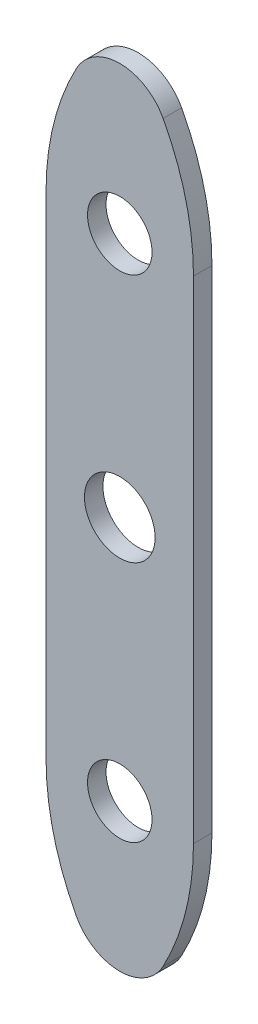
ISO-10303-21;
HEADER;
FILE_DESCRIPTION(('STEP AP214'),'2;1');
FILE_NAME('part.step','',(''),(''),'','','');
FILE_SCHEMA(('AUTOMOTIVE_DESIGN { 1 0 10303 214 1 1 1 1 }'));
ENDSEC;
DATA;
#1=APPLICATION_CONTEXT('core data for automotive mechanical design processes');
#2=APPLICATION_PROTOCOL_DEFINITION('international standard','automotive_design',2000,#1);
#3=PRODUCT_CONTEXT('',#1,'mechanical');
#4=PRODUCT('Part','Part','',(#3));
#5=PRODUCT_RELATED_PRODUCT_CATEGORY('part','',(#4));
#6=PRODUCT_DEFINITION_FORMATION('','',#4);
#7=PRODUCT_DEFINITION_CONTEXT('part definition',#1,'design');
#8=PRODUCT_DEFINITION('design','',#6,#7);
#9=PRODUCT_DEFINITION_SHAPE('','',#8);
#10=(LENGTH_UNIT() NAMED_UNIT(*) SI_UNIT(.MILLI.,.METRE.));
#11=(NAMED_UNIT(*) PLANE_ANGLE_UNIT() SI_UNIT($,.RADIAN.));
#12=(NAMED_UNIT(*) SI_UNIT($,.STERADIAN.) SOLID_ANGLE_UNIT());
#13=UNCERTAINTY_MEASURE_WITH_UNIT(LENGTH_MEASURE(1.E-05),#10,'distance_accuracy_value','');
#14=(GEOMETRIC_REPRESENTATION_CONTEXT(3) GLOBAL_UNCERTAINTY_ASSIGNED_CONTEXT((#13)) GLOBAL_UNIT_ASSIGNED_CONTEXT((#10,
#11,#12)) REPRESENTATION_CONTEXT('',''));
#15=CARTESIAN_POINT('',(0.,0.,0.));
#16=DIRECTION('',(0.,0.,1.));
#17=DIRECTION('',(1.,0.,0.));
#18=AXIS2_PLACEMENT_3D('',#15,#16,#17);
#19=CARTESIAN_POINT('',(-47.625,63.5,4.7752));
#20=DIRECTION('',(0.,0.,1.));
#21=DIRECTION('',(1.,0.,0.));
#22=AXIS2_PLACEMENT_3D('',#19,#20,#21);
#23=PLANE('',#22);
#24=CARTESIAN_POINT('',(0.,-63.5,4.7752));
#25=DIRECTION('',(0.,0.,1.));
#26=DIRECTION('',(1.,0.,0.));
#27=AXIS2_PLACEMENT_3D('',#24,#25,#26);
#28=CIRCLE('',#27,8.334375);
#29=CARTESIAN_POINT('',(8.33437500000002,-63.5,4.7752));
#30=VERTEX_POINT('',#29);
#31=EDGE_CURVE('E231',#30,#30,#28,.T.);
#32=ORIENTED_EDGE('',*,*,#31,.F.);
#33=EDGE_LOOP('',(#32));
#34=FACE_BOUND('',#33,.T.);
#35=CARTESIAN_POINT('',(-47.625,63.5,4.7752));
#36=DIRECTION('',(0.,0.,1.));
#37=DIRECTION('',(1.,0.,0.));
#38=AXIS2_PLACEMENT_3D('',#35,#36,#37);
#39=CIRCLE('',#38,66.675);
#40=CARTESIAN_POINT('',(19.05,63.5,4.7752));
#41=VERTEX_POINT('',#40);
#42=CARTESIAN_POINT('',(11.2058823529412,94.8764705882353,4.7752));
#43=VERTEX_POINT('',#42);
#44=EDGE_CURVE('E136',#41,#43,#39,.T.);
#45=ORIENTED_EDGE('',*,*,#44,.T.);
#46=CARTESIAN_POINT('',(0.,88.9,4.7752));
#47=DIRECTION('',(0.,0.,1.));
#48=DIRECTION('',(1.,0.,0.));
#49=AXIS2_PLACEMENT_3D('',#46,#47,#48);
#50=CIRCLE('',#49,12.7);
#51=CARTESIAN_POINT('',(-11.2058823529412,94.8764705882353,4.7752));
#52=VERTEX_POINT('',#51);
#53=EDGE_CURVE('E113',#43,#52,#50,.T.);
#54=ORIENTED_EDGE('',*,*,#53,.T.);
#55=CARTESIAN_POINT('',(47.625,63.5,4.7752));
#56=DIRECTION('',(0.,0.,1.));
#57=DIRECTION('',(-1.,0.,0.));
#58=AXIS2_PLACEMENT_3D('',#55,#56,#57);
#59=CIRCLE('',#58,66.675);
#60=CARTESIAN_POINT('',(-19.05,63.5,4.7752));
#61=VERTEX_POINT('',#60);
#62=EDGE_CURVE('E139',#52,#61,#59,.T.);
#63=ORIENTED_EDGE('',*,*,#62,.T.);
#64=DIRECTION('',(0.,-1.,0.));
#65=VECTOR('',#64,1.);
#66=CARTESIAN_POINT('',(-19.05,63.5,4.7752));
#67=LINE('',#66,#65);
#68=CARTESIAN_POINT('',(-19.05,-63.5,4.7752));
#69=VERTEX_POINT('',#68);
#70=EDGE_CURVE('E141',#61,#69,#67,.T.);
#71=ORIENTED_EDGE('',*,*,#70,.T.);
#72=CARTESIAN_POINT('',(47.6250000000001,-63.5,4.7752));
#73=DIRECTION('',(0.,0.,1.));
#74=DIRECTION('',(1.,0.,0.));
#75=AXIS2_PLACEMENT_3D('',#72,#73,#74);
#76=CIRCLE('',#75,66.6750000000001);
#77=CARTESIAN_POINT('',(-11.2058823529411,-94.8764705882353,4.7752));
#78=VERTEX_POINT('',#77);
#79=EDGE_CURVE('E143',#69,#78,#76,.T.);
#80=ORIENTED_EDGE('',*,*,#79,.T.);
#81=CARTESIAN_POINT('',(0.,-88.9,4.7752));
#82=DIRECTION('',(0.,0.,1.));
#83=DIRECTION('',(1.,0.,0.));
#84=AXIS2_PLACEMENT_3D('',#81,#82,#83);
#85=CIRCLE('',#84,12.7);
#86=CARTESIAN_POINT('',(11.2058823529412,-94.8764705882353,4.7752));
#87=VERTEX_POINT('',#86);
#88=EDGE_CURVE('E145',#78,#87,#85,.T.);
#89=ORIENTED_EDGE('',*,*,#88,.T.);
#90=CARTESIAN_POINT('',(-47.6250000000001,-63.5,4.7752));
#91=DIRECTION('',(0.,0.,1.));
#92=DIRECTION('',(-1.,0.,0.));
#93=AXIS2_PLACEMENT_3D('',#90,#91,#92);
#94=CIRCLE('',#93,66.6750000000001);
#95=CARTESIAN_POINT('',(19.05,-63.5,4.7752));
#96=VERTEX_POINT('',#95);
#97=EDGE_CURVE('E54',#87,#96,#94,.T.);
#98=ORIENTED_EDGE('',*,*,#97,.T.);
#99=DIRECTION('',(0.,1.,0.));
#100=VECTOR('',#99,1.);
#101=CARTESIAN_POINT('',(19.05,63.5,4.7752));
#102=LINE('',#101,#100);
#103=EDGE_CURVE('E49',#96,#41,#102,.T.);
#104=ORIENTED_EDGE('',*,*,#103,.T.);
#105=EDGE_LOOP('',(#45,#54,#63,#71,#80,#89,#98,#104));
#106=FACE_BOUND('',#105,.T.);
#107=CARTESIAN_POINT('',(0.,0.,4.7752));
#108=DIRECTION('',(0.,0.,1.));
#109=DIRECTION('',(1.,0.,0.));
#110=AXIS2_PLACEMENT_3D('',#107,#108,#109);
#111=CIRCLE('',#110,9.128125);
#112=CARTESIAN_POINT('',(9.128125,0.,4.7752));
#113=VERTEX_POINT('',#112);
#114=EDGE_CURVE('E118',#113,#113,#111,.T.);
#115=ORIENTED_EDGE('',*,*,#114,.F.);
#116=EDGE_LOOP('',(#115));
#117=FACE_BOUND('',#116,.T.);
#118=CARTESIAN_POINT('',(0.,63.5,4.7752));
#119=DIRECTION('',(0.,0.,1.));
#120=DIRECTION('',(1.,0.,0.));
#121=AXIS2_PLACEMENT_3D('',#118,#119,#120);
#122=CIRCLE('',#121,8.334375);
#123=CARTESIAN_POINT('',(8.334375,63.5,4.7752));
#124=VERTEX_POINT('',#123);
#125=EDGE_CURVE('E220',#124,#124,#122,.T.);
#126=ORIENTED_EDGE('',*,*,#125,.F.);
#127=EDGE_LOOP('',(#126));
#128=FACE_BOUND('',#127,.T.);
#129=ADVANCED_FACE('F34',(#34,#106,#117,#128),#23,.T.);
#130=CARTESIAN_POINT('',(-47.625,63.5,0.));
#131=DIRECTION('',(0.,0.,1.));
#132=DIRECTION('',(1.,0.,0.));
#133=AXIS2_PLACEMENT_3D('',#130,#131,#132);
#134=PLANE('',#133);
#135=CARTESIAN_POINT('',(0.,-63.5,0.));
#136=DIRECTION('',(0.,0.,1.));
#137=DIRECTION('',(1.,0.,0.));
#138=AXIS2_PLACEMENT_3D('',#135,#136,#137);
#139=CIRCLE('',#138,8.334375);
#140=CARTESIAN_POINT('',(8.33437500000002,-63.5,0.));
#141=VERTEX_POINT('',#140);
#142=EDGE_CURVE('E226',#141,#141,#139,.T.);
#143=ORIENTED_EDGE('',*,*,#142,.T.);
#144=EDGE_LOOP('',(#143));
#145=FACE_BOUND('',#144,.T.);
#146=CARTESIAN_POINT('',(-47.625,63.5,0.));
#147=DIRECTION('',(0.,0.,1.));
#148=DIRECTION('',(1.,0.,0.));
#149=AXIS2_PLACEMENT_3D('',#146,#147,#148);
#150=CIRCLE('',#149,66.675);
#151=CARTESIAN_POINT('',(19.05,63.5,0.));
#152=VERTEX_POINT('',#151);
#153=CARTESIAN_POINT('',(11.2058823529412,94.8764705882353,0.));
#154=VERTEX_POINT('',#153);
#155=EDGE_CURVE('E104',#152,#154,#150,.T.);
#156=ORIENTED_EDGE('',*,*,#155,.F.);
#157=DIRECTION('',(0.,1.,0.));
#158=VECTOR('',#157,1.);
#159=CARTESIAN_POINT('',(19.05,63.5,0.));
#160=LINE('',#159,#158);
#161=CARTESIAN_POINT('',(19.05,-63.5,0.));
#162=VERTEX_POINT('',#161);
#163=EDGE_CURVE('E134',#162,#152,#160,.T.);
#164=ORIENTED_EDGE('',*,*,#163,.F.);
#165=CARTESIAN_POINT('',(-47.6250000000001,-63.5,0.));
#166=DIRECTION('',(0.,0.,1.));
#167=DIRECTION('',(-1.,0.,0.));
#168=AXIS2_PLACEMENT_3D('',#165,#166,#167);
#169=CIRCLE('',#168,66.6750000000001);
#170=CARTESIAN_POINT('',(11.2058823529412,-94.8764705882353,0.));
#171=VERTEX_POINT('',#170);
#172=EDGE_CURVE('E132',#171,#162,#169,.T.);
#173=ORIENTED_EDGE('',*,*,#172,.F.);
#174=CARTESIAN_POINT('',(0.,-88.9,0.));
#175=DIRECTION('',(0.,0.,1.));
#176=DIRECTION('',(1.,0.,0.));
#177=AXIS2_PLACEMENT_3D('',#174,#175,#176);
#178=CIRCLE('',#177,12.7);
#179=CARTESIAN_POINT('',(-11.2058823529411,-94.8764705882353,0.));
#180=VERTEX_POINT('',#179);
#181=EDGE_CURVE('E130',#180,#171,#178,.T.);
#182=ORIENTED_EDGE('',*,*,#181,.F.);
#183=CARTESIAN_POINT('',(47.6250000000001,-63.5,0.));
#184=DIRECTION('',(0.,0.,1.));
#185=DIRECTION('',(1.,0.,0.));
#186=AXIS2_PLACEMENT_3D('',#183,#184,#185);
#187=CIRCLE('',#186,66.6750000000001);
#188=CARTESIAN_POINT('',(-19.05,-63.5,0.));
#189=VERTEX_POINT('',#188);
#190=EDGE_CURVE('E128',#189,#180,#187,.T.);
#191=ORIENTED_EDGE('',*,*,#190,.F.);
#192=DIRECTION('',(0.,-1.,0.));
#193=VECTOR('',#192,1.);
#194=CARTESIAN_POINT('',(-19.05,63.5,0.));
#195=LINE('',#194,#193);
#196=CARTESIAN_POINT('',(-19.05,63.5,0.));
#197=VERTEX_POINT('',#196);
#198=EDGE_CURVE('E126',#197,#189,#195,.T.);
#199=ORIENTED_EDGE('',*,*,#198,.F.);
#200=CARTESIAN_POINT('',(47.625,63.5,0.));
#201=DIRECTION('',(0.,0.,1.));
#202=DIRECTION('',(-1.,0.,0.));
#203=AXIS2_PLACEMENT_3D('',#200,#201,#202);
#204=CIRCLE('',#203,66.675);
#205=CARTESIAN_POINT('',(-11.2058823529412,94.8764705882353,0.));
#206=VERTEX_POINT('',#205);
#207=EDGE_CURVE('E106',#206,#197,#204,.T.);
#208=ORIENTED_EDGE('',*,*,#207,.F.);
#209=CARTESIAN_POINT('',(0.,88.9,0.));
#210=DIRECTION('',(0.,0.,1.));
#211=DIRECTION('',(1.,0.,0.));
#212=AXIS2_PLACEMENT_3D('',#209,#210,#211);
#213=CIRCLE('',#212,12.7);
#214=EDGE_CURVE('E99',#154,#206,#213,.T.);
#215=ORIENTED_EDGE('',*,*,#214,.F.);
#216=EDGE_LOOP('',(#156,#164,#173,#182,#191,#199,#208,#215));
#217=FACE_BOUND('',#216,.T.);
#218=CARTESIAN_POINT('',(0.,0.,0.));
#219=DIRECTION('',(0.,0.,1.));
#220=DIRECTION('',(1.,0.,0.));
#221=AXIS2_PLACEMENT_3D('',#218,#219,#220);
#222=CIRCLE('',#221,9.128125);
#223=CARTESIAN_POINT('',(9.128125,0.,0.));
#224=VERTEX_POINT('',#223);
#225=EDGE_CURVE('E121',#224,#224,#222,.T.);
#226=ORIENTED_EDGE('',*,*,#225,.T.);
#227=EDGE_LOOP('',(#226));
#228=FACE_BOUND('',#227,.T.);
#229=CARTESIAN_POINT('',(0.,63.5,0.));
#230=DIRECTION('',(0.,0.,1.));
#231=DIRECTION('',(1.,0.,0.));
#232=AXIS2_PLACEMENT_3D('',#229,#230,#231);
#233=CIRCLE('',#232,8.334375);
#234=CARTESIAN_POINT('',(8.334375,63.5,0.));
#235=VERTEX_POINT('',#234);
#236=EDGE_CURVE('E223',#235,#235,#233,.T.);
#237=ORIENTED_EDGE('',*,*,#236,.T.);
#238=EDGE_LOOP('',(#237));
#239=FACE_BOUND('',#238,.T.);
#240=ADVANCED_FACE('F100',(#145,#217,#228,#239),#134,.F.);
#241=CARTESIAN_POINT('',(-47.625,63.5,4.7752));
#242=DIRECTION('',(0.,0.,-1.));
#243=DIRECTION('',(-1.,0.,0.));
#244=AXIS2_PLACEMENT_3D('',#241,#242,#243);
#245=CYLINDRICAL_SURFACE('',#244,66.675);
#246=ORIENTED_EDGE('',*,*,#155,.T.);
#247=DIRECTION('',(0.,0.,-1.));
#248=VECTOR('',#247,1.);
#249=CARTESIAN_POINT('',(11.2058823529412,94.8764705882353,4.7752));
#250=LINE('',#249,#248);
#251=EDGE_CURVE('E11',#43,#154,#250,.T.);
#252=ORIENTED_EDGE('',*,*,#251,.F.);
#253=ORIENTED_EDGE('',*,*,#44,.F.);
#254=DIRECTION('',(0.,0.,-1.));
#255=VECTOR('',#254,1.);
#256=CARTESIAN_POINT('',(19.05,63.5,4.7752));
#257=LINE('',#256,#255);
#258=EDGE_CURVE('E117',#41,#152,#257,.T.);
#259=ORIENTED_EDGE('',*,*,#258,.T.);
#260=EDGE_LOOP('',(#246,#252,#253,#259));
#261=FACE_BOUND('',#260,.T.);
#262=ADVANCED_FACE('F36',(#261),#245,.T.);
#263=CARTESIAN_POINT('',(0.,88.9,4.7752));
#264=DIRECTION('',(0.,0.,-1.));
#265=DIRECTION('',(-1.,0.,0.));
#266=AXIS2_PLACEMENT_3D('',#263,#264,#265);
#267=CYLINDRICAL_SURFACE('',#266,12.7);
#268=ORIENTED_EDGE('',*,*,#214,.T.);
#269=DIRECTION('',(0.,0.,-1.));
#270=VECTOR('',#269,1.);
#271=CARTESIAN_POINT('',(-11.2058823529412,94.8764705882353,4.7752));
#272=LINE('',#271,#270);
#273=EDGE_CURVE('E42',#52,#206,#272,.T.);
#274=ORIENTED_EDGE('',*,*,#273,.F.);
#275=ORIENTED_EDGE('',*,*,#53,.F.);
#276=ORIENTED_EDGE('',*,*,#251,.T.);
#277=EDGE_LOOP('',(#268,#274,#275,#276));
#278=FACE_BOUND('',#277,.T.);
#279=ADVANCED_FACE('F112',(#278),#267,.T.);
#280=CARTESIAN_POINT('',(47.625,63.5,4.7752));
#281=DIRECTION('',(0.,0.,-1.));
#282=DIRECTION('',(-1.,0.,0.));
#283=AXIS2_PLACEMENT_3D('',#280,#281,#282);
#284=CYLINDRICAL_SURFACE('',#283,66.675);
#285=ORIENTED_EDGE('',*,*,#207,.T.);
#286=DIRECTION('',(0.,0.,-1.));
#287=VECTOR('',#286,1.);
#288=CARTESIAN_POINT('',(-19.05,63.5,4.7752));
#289=LINE('',#288,#287);
#290=EDGE_CURVE('E162',#61,#197,#289,.T.);
#291=ORIENTED_EDGE('',*,*,#290,.F.);
#292=ORIENTED_EDGE('',*,*,#62,.F.);
#293=ORIENTED_EDGE('',*,*,#273,.T.);
#294=EDGE_LOOP('',(#285,#291,#292,#293));
#295=FACE_BOUND('',#294,.T.);
#296=ADVANCED_FACE('F166',(#295),#284,.T.);
#297=CARTESIAN_POINT('',(-19.05,63.5,4.7752));
#298=DIRECTION('',(1.,0.,0.));
#299=DIRECTION('',(0.,1.,0.));
#300=AXIS2_PLACEMENT_3D('',#297,#298,#299);
#301=PLANE('',#300);
#302=ORIENTED_EDGE('',*,*,#198,.T.);
#303=DIRECTION('',(0.,0.,-1.));
#304=VECTOR('',#303,1.);
#305=CARTESIAN_POINT('',(-19.05,-63.5,4.7752));
#306=LINE('',#305,#304);
#307=EDGE_CURVE('E159',#69,#189,#306,.T.);
#308=ORIENTED_EDGE('',*,*,#307,.F.);
#309=ORIENTED_EDGE('',*,*,#70,.F.);
#310=ORIENTED_EDGE('',*,*,#290,.T.);
#311=EDGE_LOOP('',(#302,#308,#309,#310));
#312=FACE_BOUND('',#311,.T.);
#313=ADVANCED_FACE('F174',(#312),#301,.F.);
#314=CARTESIAN_POINT('',(47.6250000000001,-63.5,4.7752));
#315=DIRECTION('',(0.,0.,-1.));
#316=DIRECTION('',(-1.,0.,0.));
#317=AXIS2_PLACEMENT_3D('',#314,#315,#316);
#318=CYLINDRICAL_SURFACE('',#317,66.6750000000001);
#319=ORIENTED_EDGE('',*,*,#190,.T.);
#320=DIRECTION('',(0.,0.,-1.));
#321=VECTOR('',#320,1.);
#322=CARTESIAN_POINT('',(-11.2058823529411,-94.8764705882353,4.7752));
#323=LINE('',#322,#321);
#324=EDGE_CURVE('E156',#78,#180,#323,.T.);
#325=ORIENTED_EDGE('',*,*,#324,.F.);
#326=ORIENTED_EDGE('',*,*,#79,.F.);
#327=ORIENTED_EDGE('',*,*,#307,.T.);
#328=EDGE_LOOP('',(#319,#325,#326,#327));
#329=FACE_BOUND('',#328,.T.);
#330=ADVANCED_FACE('F177',(#329),#318,.T.);
#331=CARTESIAN_POINT('',(0.,-88.9,4.7752));
#332=DIRECTION('',(0.,0.,-1.));
#333=DIRECTION('',(-1.,0.,0.));
#334=AXIS2_PLACEMENT_3D('',#331,#332,#333);
#335=CYLINDRICAL_SURFACE('',#334,12.7);
#336=ORIENTED_EDGE('',*,*,#181,.T.);
#337=DIRECTION('',(0.,0.,-1.));
#338=VECTOR('',#337,1.);
#339=CARTESIAN_POINT('',(11.2058823529412,-94.8764705882353,4.7752));
#340=LINE('',#339,#338);
#341=EDGE_CURVE('E153',#87,#171,#340,.T.);
#342=ORIENTED_EDGE('',*,*,#341,.F.);
#343=ORIENTED_EDGE('',*,*,#88,.F.);
#344=ORIENTED_EDGE('',*,*,#324,.T.);
#345=EDGE_LOOP('',(#336,#342,#343,#344));
#346=FACE_BOUND('',#345,.T.);
#347=ADVANCED_FACE('F182',(#346),#335,.T.);
#348=CARTESIAN_POINT('',(-47.6250000000001,-63.5,4.7752));
#349=DIRECTION('',(0.,0.,-1.));
#350=DIRECTION('',(-1.,0.,0.));
#351=AXIS2_PLACEMENT_3D('',#348,#349,#350);
#352=CYLINDRICAL_SURFACE('',#351,66.6750000000001);
#353=ORIENTED_EDGE('',*,*,#172,.T.);
#354=DIRECTION('',(0.,0.,-1.));
#355=VECTOR('',#354,1.);
#356=CARTESIAN_POINT('',(19.05,-63.5,4.7752));
#357=LINE('',#356,#355);
#358=EDGE_CURVE('E150',#96,#162,#357,.T.);
#359=ORIENTED_EDGE('',*,*,#358,.F.);
#360=ORIENTED_EDGE('',*,*,#97,.F.);
#361=ORIENTED_EDGE('',*,*,#341,.T.);
#362=EDGE_LOOP('',(#353,#359,#360,#361));
#363=FACE_BOUND('',#362,.T.);
#364=ADVANCED_FACE('F185',(#363),#352,.T.);
#365=CARTESIAN_POINT('',(19.05,63.5,4.7752));
#366=DIRECTION('',(-1.,0.,0.));
#367=DIRECTION('',(0.,-1.,0.));
#368=AXIS2_PLACEMENT_3D('',#365,#366,#367);
#369=PLANE('',#368);
#370=ORIENTED_EDGE('',*,*,#163,.T.);
#371=ORIENTED_EDGE('',*,*,#258,.F.);
#372=ORIENTED_EDGE('',*,*,#103,.F.);
#373=ORIENTED_EDGE('',*,*,#358,.T.);
#374=EDGE_LOOP('',(#370,#371,#372,#373));
#375=FACE_BOUND('',#374,.T.);
#376=ADVANCED_FACE('F187',(#375),#369,.F.);
#377=CARTESIAN_POINT('',(0.,0.,4.7752));
#378=DIRECTION('',(0.,0.,-1.));
#379=DIRECTION('',(-1.,0.,0.));
#380=AXIS2_PLACEMENT_3D('',#377,#378,#379);
#381=CYLINDRICAL_SURFACE('',#380,9.128125);
#382=ORIENTED_EDGE('',*,*,#114,.T.);
#383=EDGE_LOOP('',(#382));
#384=FACE_BOUND('',#383,.T.);
#385=ORIENTED_EDGE('',*,*,#225,.F.);
#386=EDGE_LOOP('',(#385));
#387=FACE_BOUND('',#386,.T.);
#388=ADVANCED_FACE('F189',(#384,#387),#381,.F.);
#389=CARTESIAN_POINT('',(0.,-63.5,4.7752));
#390=DIRECTION('',(0.,0.,-1.));
#391=DIRECTION('',(-1.,0.,0.));
#392=AXIS2_PLACEMENT_3D('',#389,#390,#391);
#393=CYLINDRICAL_SURFACE('',#392,8.334375);
#394=ORIENTED_EDGE('',*,*,#31,.T.);
#395=EDGE_LOOP('',(#394));
#396=FACE_BOUND('',#395,.T.);
#397=ORIENTED_EDGE('',*,*,#142,.F.);
#398=EDGE_LOOP('',(#397));
#399=FACE_BOUND('',#398,.T.);
#400=ADVANCED_FACE('F195',(#396,#399),#393,.F.);
#401=CARTESIAN_POINT('',(0.,63.5,4.7752));
#402=DIRECTION('',(0.,0.,-1.));
#403=DIRECTION('',(-1.,0.,0.));
#404=AXIS2_PLACEMENT_3D('',#401,#402,#403);
#405=CYLINDRICAL_SURFACE('',#404,8.334375);
#406=ORIENTED_EDGE('',*,*,#125,.T.);
#407=EDGE_LOOP('',(#406));
#408=FACE_BOUND('',#407,.T.);
#409=ORIENTED_EDGE('',*,*,#236,.F.);
#410=EDGE_LOOP('',(#409));
#411=FACE_BOUND('',#410,.T.);
#412=ADVANCED_FACE('F211',(#408,#411),#405,.F.);
#413=CLOSED_SHELL('',(#129,#240,#262,#279,#296,#313,#330,#347,#364,#376,#388,#400,#412));
#414=MANIFOLD_SOLID_BREP('B2',#413);
#415=ADVANCED_BREP_SHAPE_REPRESENTATION('',(#18,#414),#14);
#416=SHAPE_DEFINITION_REPRESENTATION(#9,#415);
ENDSEC;
END-ISO-10303-21;
